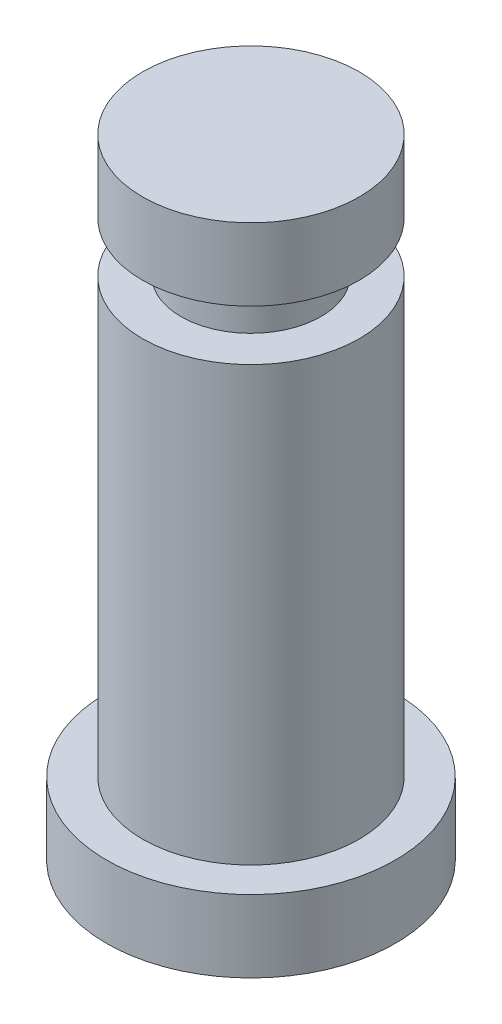
ISO-10303-21;
HEADER;
FILE_DESCRIPTION(('STEP AP214'),'2;1');
FILE_NAME('part.step','',(''),(''),'','','');
FILE_SCHEMA(('AUTOMOTIVE_DESIGN { 1 0 10303 214 1 1 1 1 }'));
ENDSEC;
DATA;
#1=APPLICATION_CONTEXT('core data for automotive mechanical design processes');
#2=APPLICATION_PROTOCOL_DEFINITION('international standard','automotive_design',2000,#1);
#3=PRODUCT_CONTEXT('',#1,'mechanical');
#4=PRODUCT('Part','Part','',(#3));
#5=PRODUCT_RELATED_PRODUCT_CATEGORY('part','',(#4));
#6=PRODUCT_DEFINITION_FORMATION('','',#4);
#7=PRODUCT_DEFINITION_CONTEXT('part definition',#1,'design');
#8=PRODUCT_DEFINITION('design','',#6,#7);
#9=PRODUCT_DEFINITION_SHAPE('','',#8);
#10=(LENGTH_UNIT() NAMED_UNIT(*) SI_UNIT(.MILLI.,.METRE.));
#11=(NAMED_UNIT(*) PLANE_ANGLE_UNIT() SI_UNIT($,.RADIAN.));
#12=(NAMED_UNIT(*) SI_UNIT($,.STERADIAN.) SOLID_ANGLE_UNIT());
#13=UNCERTAINTY_MEASURE_WITH_UNIT(LENGTH_MEASURE(1.E-05),#10,'distance_accuracy_value','');
#14=(GEOMETRIC_REPRESENTATION_CONTEXT(3) GLOBAL_UNCERTAINTY_ASSIGNED_CONTEXT((#13)) GLOBAL_UNIT_ASSIGNED_CONTEXT((#10,
#11,#12)) REPRESENTATION_CONTEXT('',''));
#15=CARTESIAN_POINT('',(0.,0.,0.));
#16=DIRECTION('',(0.,0.,1.));
#17=DIRECTION('',(1.,0.,0.));
#18=AXIS2_PLACEMENT_3D('',#15,#16,#17);
#19=CARTESIAN_POINT('',(0.,48.5,0.));
#20=DIRECTION('',(0.,1.,0.));
#21=DIRECTION('',(-1.,0.,0.));
#22=AXIS2_PLACEMENT_3D('',#19,#20,#21);
#23=CYLINDRICAL_SURFACE('',#22,7.5);
#24=CARTESIAN_POINT('',(0.,5.,0.));
#25=DIRECTION('',(0.,1.,0.));
#26=DIRECTION('',(-1.,0.,0.));
#27=AXIS2_PLACEMENT_3D('',#24,#25,#26);
#28=CIRCLE('',#27,7.5);
#29=CARTESIAN_POINT('',(-7.49999999999999,5.,0.));
#30=VERTEX_POINT('',#29);
#31=EDGE_CURVE('E50',#30,#30,#28,.T.);
#32=ORIENTED_EDGE('',*,*,#31,.T.);
#33=EDGE_LOOP('',(#32));
#34=FACE_BOUND('',#33,.T.);
#35=CARTESIAN_POINT('',(0.,35.,0.));
#36=DIRECTION('',(0.,1.,0.));
#37=DIRECTION('',(-1.,0.,0.));
#38=AXIS2_PLACEMENT_3D('',#35,#36,#37);
#39=CIRCLE('',#38,7.50000000000001);
#40=CARTESIAN_POINT('',(-7.50000000000001,35.,0.));
#41=VERTEX_POINT('',#40);
#42=EDGE_CURVE('E68',#41,#41,#39,.T.);
#43=ORIENTED_EDGE('',*,*,#42,.F.);
#44=EDGE_LOOP('',(#43));
#45=FACE_BOUND('',#44,.T.);
#46=ADVANCED_FACE('F39',(#34,#45),#23,.T.);
#47=CARTESIAN_POINT('',(0.,0.,0.));
#48=DIRECTION('',(0.,1.,0.));
#49=DIRECTION('',(-1.,0.,0.));
#50=AXIS2_PLACEMENT_3D('',#47,#48,#49);
#51=PLANE('',#50);
#52=CARTESIAN_POINT('',(0.,0.,0.));
#53=DIRECTION('',(0.,1.,0.));
#54=DIRECTION('',(-1.,0.,0.));
#55=AXIS2_PLACEMENT_3D('',#52,#53,#54);
#56=CIRCLE('',#55,10.);
#57=CARTESIAN_POINT('',(-9.99999999999999,0.,0.));
#58=VERTEX_POINT('',#57);
#59=EDGE_CURVE('E10',#58,#58,#56,.T.);
#60=ORIENTED_EDGE('',*,*,#59,.F.);
#61=EDGE_LOOP('',(#60));
#62=FACE_BOUND('',#61,.T.);
#63=ADVANCED_FACE('F41',(#62),#51,.F.);
#64=CARTESIAN_POINT('',(0.,48.5,0.));
#65=DIRECTION('',(0.,1.,0.));
#66=DIRECTION('',(-1.,0.,0.));
#67=AXIS2_PLACEMENT_3D('',#64,#65,#66);
#68=CYLINDRICAL_SURFACE('',#67,10.);
#69=CARTESIAN_POINT('',(0.,5.,0.));
#70=DIRECTION('',(0.,1.,0.));
#71=DIRECTION('',(-1.,0.,0.));
#72=AXIS2_PLACEMENT_3D('',#69,#70,#71);
#73=CIRCLE('',#72,10.);
#74=CARTESIAN_POINT('',(-9.99999999999999,5.,0.));
#75=VERTEX_POINT('',#74);
#76=EDGE_CURVE('E46',#75,#75,#73,.T.);
#77=ORIENTED_EDGE('',*,*,#76,.F.);
#78=EDGE_LOOP('',(#77));
#79=FACE_BOUND('',#78,.T.);
#80=ORIENTED_EDGE('',*,*,#59,.T.);
#81=EDGE_LOOP('',(#80));
#82=FACE_BOUND('',#81,.T.);
#83=ADVANCED_FACE('F84',(#79,#82),#68,.T.);
#84=CARTESIAN_POINT('',(10.,5.,0.));
#85=DIRECTION('',(0.,-1.,0.));
#86=DIRECTION('',(1.,0.,0.));
#87=AXIS2_PLACEMENT_3D('',#84,#85,#86);
#88=PLANE('',#87);
#89=ORIENTED_EDGE('',*,*,#31,.F.);
#90=EDGE_LOOP('',(#89));
#91=FACE_BOUND('',#90,.T.);
#92=ORIENTED_EDGE('',*,*,#76,.T.);
#93=EDGE_LOOP('',(#92));
#94=FACE_BOUND('',#93,.T.);
#95=ADVANCED_FACE('F101',(#91,#94),#88,.F.);
#96=CARTESIAN_POINT('',(7.50000000000001,38.5,0.));
#97=DIRECTION('',(0.,-1.,0.));
#98=DIRECTION('',(1.,0.,0.));
#99=AXIS2_PLACEMENT_3D('',#96,#97,#98);
#100=PLANE('',#99);
#101=CARTESIAN_POINT('',(0.,38.5,0.));
#102=DIRECTION('',(0.,1.,0.));
#103=DIRECTION('',(-1.,0.,0.));
#104=AXIS2_PLACEMENT_3D('',#101,#102,#103);
#105=CIRCLE('',#104,4.85000000000001);
#106=CARTESIAN_POINT('',(-4.85000000000001,38.5,0.));
#107=VERTEX_POINT('',#106);
#108=EDGE_CURVE('E62',#107,#107,#105,.T.);
#109=ORIENTED_EDGE('',*,*,#108,.T.);
#110=EDGE_LOOP('',(#109));
#111=FACE_BOUND('',#110,.T.);
#112=CARTESIAN_POINT('',(0.,38.5,0.));
#113=DIRECTION('',(0.,1.,0.));
#114=DIRECTION('',(-1.,0.,0.));
#115=AXIS2_PLACEMENT_3D('',#112,#113,#114);
#116=CIRCLE('',#115,7.50000000000001);
#117=CARTESIAN_POINT('',(-7.50000000000001,38.5,0.));
#118=VERTEX_POINT('',#117);
#119=EDGE_CURVE('E59',#118,#118,#116,.T.);
#120=ORIENTED_EDGE('',*,*,#119,.F.);
#121=EDGE_LOOP('',(#120));
#122=FACE_BOUND('',#121,.T.);
#123=ADVANCED_FACE('F99',(#111,#122),#100,.T.);
#124=CARTESIAN_POINT('',(0.,43.5,0.));
#125=DIRECTION('',(0.,1.,0.));
#126=DIRECTION('',(-1.,0.,0.));
#127=AXIS2_PLACEMENT_3D('',#124,#125,#126);
#128=CYLINDRICAL_SURFACE('',#127,4.85000000000001);
#129=CARTESIAN_POINT('',(0.,35.,0.));
#130=DIRECTION('',(0.,1.,0.));
#131=DIRECTION('',(-1.,0.,0.));
#132=AXIS2_PLACEMENT_3D('',#129,#130,#131);
#133=CIRCLE('',#132,4.85000000000001);
#134=CARTESIAN_POINT('',(-4.85,35.,0.));
#135=VERTEX_POINT('',#134);
#136=EDGE_CURVE('E65',#135,#135,#133,.T.);
#137=ORIENTED_EDGE('',*,*,#136,.T.);
#138=EDGE_LOOP('',(#137));
#139=FACE_BOUND('',#138,.T.);
#140=ORIENTED_EDGE('',*,*,#108,.F.);
#141=EDGE_LOOP('',(#140));
#142=FACE_BOUND('',#141,.T.);
#143=ADVANCED_FACE('F100',(#139,#142),#128,.T.);
#144=CARTESIAN_POINT('',(7.50000000000001,35.,0.));
#145=DIRECTION('',(0.,1.,0.));
#146=DIRECTION('',(-1.,0.,0.));
#147=AXIS2_PLACEMENT_3D('',#144,#145,#146);
#148=PLANE('',#147);
#149=ORIENTED_EDGE('',*,*,#42,.T.);
#150=EDGE_LOOP('',(#149));
#151=FACE_BOUND('',#150,.T.);
#152=ORIENTED_EDGE('',*,*,#136,.F.);
#153=EDGE_LOOP('',(#152));
#154=FACE_BOUND('',#153,.T.);
#155=ADVANCED_FACE('F72',(#151,#154),#148,.T.);
#156=CARTESIAN_POINT('',(7.5,43.5,0.));
#157=DIRECTION('',(0.,-1.,0.));
#158=DIRECTION('',(1.,0.,0.));
#159=AXIS2_PLACEMENT_3D('',#156,#157,#158);
#160=PLANE('',#159);
#161=CARTESIAN_POINT('',(0.,43.5,0.));
#162=DIRECTION('',(0.,1.,0.));
#163=DIRECTION('',(-1.,0.,0.));
#164=AXIS2_PLACEMENT_3D('',#161,#162,#163);
#165=CIRCLE('',#164,7.5);
#166=CARTESIAN_POINT('',(-7.5,43.5,0.));
#167=VERTEX_POINT('',#166);
#168=EDGE_CURVE('E54',#167,#167,#165,.T.);
#169=ORIENTED_EDGE('',*,*,#168,.T.);
#170=EDGE_LOOP('',(#169));
#171=FACE_BOUND('',#170,.T.);
#172=ADVANCED_FACE('F89',(#171),#160,.F.);
#173=ORIENTED_EDGE('',*,*,#168,.F.);
#174=EDGE_LOOP('',(#173));
#175=FACE_BOUND('',#174,.T.);
#176=ORIENTED_EDGE('',*,*,#119,.T.);
#177=EDGE_LOOP('',(#176));
#178=FACE_BOUND('',#177,.T.);
#179=ADVANCED_FACE('F78',(#175,#178),#23,.T.);
#180=CLOSED_SHELL('',(#46,#63,#83,#95,#123,#143,#155,#172,#179));
#181=MANIFOLD_SOLID_BREP('B2',#180);
#182=ADVANCED_BREP_SHAPE_REPRESENTATION('',(#18,#181),#14);
#183=SHAPE_DEFINITION_REPRESENTATION(#9,#182);
ENDSEC;
END-ISO-10303-21;
